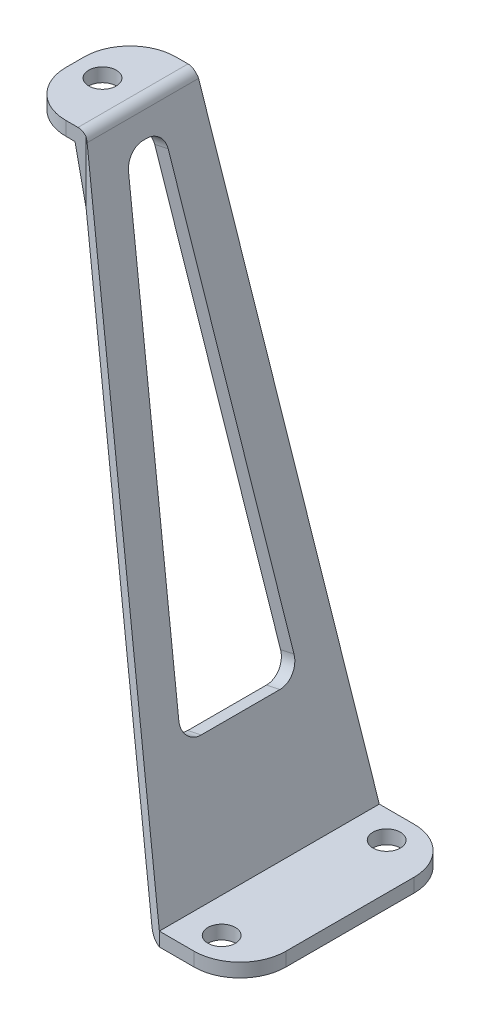
ISO-10303-21;
HEADER;
FILE_DESCRIPTION(('STEP AP214'),'2;1');
FILE_NAME('part.step','',(''),(''),'','','');
FILE_SCHEMA(('AUTOMOTIVE_DESIGN { 1 0 10303 214 1 1 1 1 }'));
ENDSEC;
DATA;
#1=APPLICATION_CONTEXT('core data for automotive mechanical design processes');
#2=APPLICATION_PROTOCOL_DEFINITION('international standard','automotive_design',2000,#1);
#3=PRODUCT_CONTEXT('',#1,'mechanical');
#4=PRODUCT('Part','Part','',(#3));
#5=PRODUCT_RELATED_PRODUCT_CATEGORY('part','',(#4));
#6=PRODUCT_DEFINITION_FORMATION('','',#4);
#7=PRODUCT_DEFINITION_CONTEXT('part definition',#1,'design');
#8=PRODUCT_DEFINITION('design','',#6,#7);
#9=PRODUCT_DEFINITION_SHAPE('','',#8);
#10=(LENGTH_UNIT() NAMED_UNIT(*) SI_UNIT(.MILLI.,.METRE.));
#11=(NAMED_UNIT(*) PLANE_ANGLE_UNIT() SI_UNIT($,.RADIAN.));
#12=(NAMED_UNIT(*) SI_UNIT($,.STERADIAN.) SOLID_ANGLE_UNIT());
#13=UNCERTAINTY_MEASURE_WITH_UNIT(LENGTH_MEASURE(1.E-05),#10,'distance_accuracy_value','');
#14=(GEOMETRIC_REPRESENTATION_CONTEXT(3) GLOBAL_UNCERTAINTY_ASSIGNED_CONTEXT((#13)) GLOBAL_UNIT_ASSIGNED_CONTEXT((#10,
#11,#12)) REPRESENTATION_CONTEXT('',''));
#15=CARTESIAN_POINT('',(0.,0.,0.));
#16=DIRECTION('',(0.,0.,1.));
#17=DIRECTION('',(1.,0.,0.));
#18=AXIS2_PLACEMENT_3D('',#15,#16,#17);
#19=CARTESIAN_POINT('',(-21.2,65.5,12.));
#20=DIRECTION('',(1.,0.,0.));
#21=DIRECTION('',(0.,0.,-1.));
#22=AXIS2_PLACEMENT_3D('',#19,#20,#21);
#23=PLANE('',#22);
#24=DIRECTION('',(0.,0.,-1.));
#25=VECTOR('',#24,1.);
#26=CARTESIAN_POINT('',(-21.2,64.,12.));
#27=LINE('',#26,#25);
#28=CARTESIAN_POINT('',(-21.2,64.,1.));
#29=VERTEX_POINT('',#28);
#30=CARTESIAN_POINT('',(-21.2,64.,-1.));
#31=VERTEX_POINT('',#30);
#32=EDGE_CURVE('E255',#29,#31,#27,.T.);
#33=ORIENTED_EDGE('',*,*,#32,.F.);
#34=DIRECTION('',(0.,1.,0.));
#35=VECTOR('',#34,1.);
#36=CARTESIAN_POINT('',(-21.2,65.5,1.));
#37=LINE('',#36,#35);
#38=CARTESIAN_POINT('',(-21.2,65.5,1.));
#39=VERTEX_POINT('',#38);
#40=EDGE_CURVE('E282',#29,#39,#37,.T.);
#41=ORIENTED_EDGE('',*,*,#40,.T.);
#42=DIRECTION('',(0.,0.,-1.));
#43=VECTOR('',#42,1.);
#44=CARTESIAN_POINT('',(-21.2,65.5,12.));
#45=LINE('',#44,#43);
#46=CARTESIAN_POINT('',(-21.2,65.5,-1.));
#47=VERTEX_POINT('',#46);
#48=EDGE_CURVE('E241',#39,#47,#45,.T.);
#49=ORIENTED_EDGE('',*,*,#48,.T.);
#50=DIRECTION('',(0.,1.,0.));
#51=VECTOR('',#50,1.);
#52=CARTESIAN_POINT('',(-21.2,64.,-1.));
#53=LINE('',#52,#51);
#54=EDGE_CURVE('E280',#47,#31,#53,.F.);
#55=ORIENTED_EDGE('',*,*,#54,.T.);
#56=EDGE_LOOP('',(#33,#41,#49,#55));
#57=FACE_BOUND('',#56,.T.);
#58=ADVANCED_FACE('F33',(#57),#23,.F.);
#59=CARTESIAN_POINT('',(-15.2,64.,12.));
#60=DIRECTION('',(0.,1.,0.));
#61=DIRECTION('',(0.,0.,1.));
#62=AXIS2_PLACEMENT_3D('',#59,#60,#61);
#63=PLANE('',#62);
#64=CARTESIAN_POINT('',(-18.2,64.,0.));
#65=DIRECTION('',(0.,1.,0.));
#66=DIRECTION('',(0.,0.,1.));
#67=AXIS2_PLACEMENT_3D('',#64,#65,#66);
#68=CIRCLE('',#67,1.5);
#69=CARTESIAN_POINT('',(-18.2,64.,1.5));
#70=VERTEX_POINT('',#69);
#71=EDGE_CURVE('E410',#70,#70,#68,.T.);
#72=ORIENTED_EDGE('',*,*,#71,.T.);
#73=EDGE_LOOP('',(#72));
#74=FACE_BOUND('',#73,.T.);
#75=DIRECTION('',(1.,0.,0.));
#76=VECTOR('',#75,1.);
#77=CARTESIAN_POINT('',(-15.2,64.,6.));
#78=LINE('',#77,#76);
#79=CARTESIAN_POINT('',(-16.2,64.,6.));
#80=VERTEX_POINT('',#79);
#81=CARTESIAN_POINT('',(-15.2,64.,6.));
#82=VERTEX_POINT('',#81);
#83=EDGE_CURVE('E405',#80,#82,#78,.T.);
#84=ORIENTED_EDGE('',*,*,#83,.F.);
#85=CARTESIAN_POINT('',(-16.2,64.,1.));
#86=DIRECTION('',(0.,1.,0.));
#87=DIRECTION('',(0.,0.,1.));
#88=AXIS2_PLACEMENT_3D('',#85,#86,#87);
#89=CIRCLE('',#88,5.);
#90=EDGE_CURVE('E294',#80,#29,#89,.F.);
#91=ORIENTED_EDGE('',*,*,#90,.T.);
#92=ORIENTED_EDGE('',*,*,#32,.T.);
#93=CARTESIAN_POINT('',(-16.2,64.,-1.));
#94=DIRECTION('',(0.,1.,0.));
#95=DIRECTION('',(0.,0.,1.));
#96=AXIS2_PLACEMENT_3D('',#93,#94,#95);
#97=CIRCLE('',#96,5.);
#98=CARTESIAN_POINT('',(-16.2,64.,-6.));
#99=VERTEX_POINT('',#98);
#100=EDGE_CURVE('E292',#31,#99,#97,.F.);
#101=ORIENTED_EDGE('',*,*,#100,.T.);
#102=DIRECTION('',(-1.,0.,0.));
#103=VECTOR('',#102,1.);
#104=CARTESIAN_POINT('',(-15.2,64.,-6.));
#105=LINE('',#104,#103);
#106=CARTESIAN_POINT('',(-15.2,64.,-6.));
#107=VERTEX_POINT('',#106);
#108=EDGE_CURVE('E400',#107,#99,#105,.T.);
#109=ORIENTED_EDGE('',*,*,#108,.F.);
#110=DIRECTION('',(0.,0.,-1.));
#111=VECTOR('',#110,1.);
#112=CARTESIAN_POINT('',(-15.2,64.,12.));
#113=LINE('',#112,#111);
#114=EDGE_CURVE('E252',#82,#107,#113,.T.);
#115=ORIENTED_EDGE('',*,*,#114,.F.);
#116=EDGE_LOOP('',(#84,#91,#92,#101,#109,#115));
#117=FACE_BOUND('',#116,.T.);
#118=ADVANCED_FACE('F464',(#74,#117),#63,.F.);
#119=CARTESIAN_POINT('',(-1.21351525368033,-1.5,12.));
#120=DIRECTION('',(0.977952752107879,0.208826278625621,0.));
#121=DIRECTION('',(-0.208826278625621,0.977952752107879,0.));
#122=AXIS2_PLACEMENT_3D('',#119,#120,#121);
#123=PLANE('',#122);
#124=DIRECTION('',(0.207993352675428,-0.974052082945671,0.089226145002657));
#125=VECTOR('',#124,1.);
#126=CARTESIAN_POINT('',(-1.1410017035461,-1.83958765336245,8.12379984031756));
#127=LINE('',#126,#125);
#128=CARTESIAN_POINT('',(-14.387815366747,60.1964643409008,2.44110805458352));
#129=VERTEX_POINT('',#128);
#130=CARTESIAN_POINT('',(-4.78180654996839,15.2106377439384,6.56194713216787));
#131=VERTEX_POINT('',#130);
#132=EDGE_CURVE('E224',#129,#131,#127,.T.);
#133=ORIENTED_EDGE('',*,*,#132,.T.);
#134=CARTESIAN_POINT('',(-4.74454102233436,15.0361198358077,4.56992434610545));
#135=DIRECTION('',(0.977952752107879,0.208826278625621,0.));
#136=DIRECTION('',(-0.208826278625621,0.977952752107879,0.));
#137=AXIS2_PLACEMENT_3D('',#134,#135,#136);
#138=CIRCLE('',#137,2.);
#139=CARTESIAN_POINT('',(-4.32688846508312,13.080214331592,4.56992434610546));
#140=VERTEX_POINT('',#139);
#141=EDGE_CURVE('E12',#131,#140,#138,.T.);
#142=ORIENTED_EDGE('',*,*,#141,.T.);
#143=DIRECTION('',(0.,0.,-1.));
#144=VECTOR('',#143,1.);
#145=CARTESIAN_POINT('',(-4.32688846508312,13.080214331592,12.));
#146=LINE('',#145,#144);
#147=CARTESIAN_POINT('',(-4.32688846508312,13.080214331592,-4.01406932324407));
#148=VERTEX_POINT('',#147);
#149=EDGE_CURVE('E358',#140,#148,#146,.T.);
#150=ORIENTED_EDGE('',*,*,#149,.T.);
#151=CARTESIAN_POINT('',(-4.74454102233436,15.0361198358077,-4.01406932324407));
#152=DIRECTION('',(0.977952752107879,0.208826278625621,0.));
#153=DIRECTION('',(-0.208826278625621,0.977952752107879,0.));
#154=AXIS2_PLACEMENT_3D('',#151,#152,#153);
#155=CIRCLE('',#154,2.);
#156=CARTESIAN_POINT('',(-4.78180654996839,15.2106377439384,-6.00609210930649));
#157=VERTEX_POINT('',#156);
#158=EDGE_CURVE('E348',#148,#157,#155,.T.);
#159=ORIENTED_EDGE('',*,*,#158,.T.);
#160=DIRECTION('',(-0.207993352675428,0.974052082945671,0.0892261450026568));
#161=VECTOR('',#160,1.);
#162=CARTESIAN_POINT('',(-1.57608857974087,0.197964376875611,-7.38129882995345));
#163=LINE('',#162,#161);
#164=CARTESIAN_POINT('',(-14.387815366747,60.1964643409008,-1.88525303172214));
#165=VERTEX_POINT('',#164);
#166=EDGE_CURVE('E375',#157,#165,#163,.T.);
#167=ORIENTED_EDGE('',*,*,#166,.T.);
#168=CARTESIAN_POINT('',(-14.3505498391129,60.0219464327701,0.106769754340266));
#169=DIRECTION('',(0.977952752107879,0.208826278625621,0.));
#170=DIRECTION('',(-0.208826278625621,0.977952752107879,0.));
#171=AXIS2_PLACEMENT_3D('',#168,#169,#170);
#172=CIRCLE('',#171,2.);
#173=CARTESIAN_POINT('',(-14.7682023963642,61.9778519369859,0.106769754340267));
#174=VERTEX_POINT('',#173);
#175=EDGE_CURVE('E328',#165,#174,#172,.T.);
#176=ORIENTED_EDGE('',*,*,#175,.T.);
#177=DIRECTION('',(0.,0.,1.));
#178=VECTOR('',#177,1.);
#179=CARTESIAN_POINT('',(-14.7682023963642,61.9778519369859,12.));
#180=LINE('',#179,#178);
#181=CARTESIAN_POINT('',(-14.7682023963642,61.9778519369859,0.449085268521107));
#182=VERTEX_POINT('',#181);
#183=EDGE_CURVE('E377',#174,#182,#180,.T.);
#184=ORIENTED_EDGE('',*,*,#183,.T.);
#185=CARTESIAN_POINT('',(-14.3505498391129,60.0219464327701,0.449085268521107));
#186=DIRECTION('',(0.977952752107879,0.208826278625621,0.));
#187=DIRECTION('',(-0.208826278625621,0.977952752107879,0.));
#188=AXIS2_PLACEMENT_3D('',#185,#186,#187);
#189=CIRCLE('',#188,2.);
#190=EDGE_CURVE('E337',#182,#129,#189,.T.);
#191=ORIENTED_EDGE('',*,*,#190,.T.);
#192=EDGE_LOOP('',(#133,#142,#150,#159,#167,#176,#184,#191));
#193=FACE_BOUND('',#192,.T.);
#194=DIRECTION('',(-0.207993352675428,0.974052082945671,0.0892261450026568));
#195=VECTOR('',#194,1.);
#196=CARTESIAN_POINT('',(-1.64925676977159,0.540617769342482,-11.2924926600136));
#197=LINE('',#196,#195);
#198=CARTESIAN_POINT('',(-1.39935209496676,-0.629708906488185,-11.3996981570362));
#199=VERTEX_POINT('',#198);
#200=CARTESIAN_POINT('',(-13.9864847463197,58.3169959744906,-6.));
#201=VERTEX_POINT('',#200);
#202=EDGE_CURVE('E390',#199,#201,#197,.T.);
#203=ORIENTED_EDGE('',*,*,#202,.F.);
#204=DIRECTION('',(0.,0.,-1.));
#205=VECTOR('',#204,1.);
#206=CARTESIAN_POINT('',(-1.39935209496676,-0.629708906488185,12.));
#207=LINE('',#206,#205);
#208=CARTESIAN_POINT('',(-1.39935209496676,-0.629708906488184,11.3996981570362));
#209=VERTEX_POINT('',#208);
#210=EDGE_CURVE('E302',#199,#209,#207,.F.);
#211=ORIENTED_EDGE('',*,*,#210,.T.);
#212=DIRECTION('',(0.207993352675428,-0.974052082945671,0.0892261450026568));
#213=VECTOR('',#212,1.);
#214=CARTESIAN_POINT('',(-1.20385408868184,-1.54524412809073,11.4835639788624));
#215=LINE('',#214,#213);
#216=CARTESIAN_POINT('',(-13.9864847463197,58.3169959744905,6.));
#217=VERTEX_POINT('',#216);
#218=EDGE_CURVE('E395',#217,#209,#215,.T.);
#219=ORIENTED_EDGE('',*,*,#218,.F.);
#220=DIRECTION('',(0.208826278625621,-0.977952752107879,0.));
#221=VECTOR('',#220,1.);
#222=CARTESIAN_POINT('',(-1.21351525368033,-1.5,6.));
#223=LINE('',#222,#221);
#224=EDGE_CURVE('E403',#82,#217,#223,.T.);
#225=ORIENTED_EDGE('',*,*,#224,.F.);
#226=ORIENTED_EDGE('',*,*,#114,.T.);
#227=DIRECTION('',(-0.208826278625621,0.977952752107879,0.));
#228=VECTOR('',#227,1.);
#229=CARTESIAN_POINT('',(-1.21351525368033,-1.5,-6.00000000000001));
#230=LINE('',#229,#228);
#231=EDGE_CURVE('E398',#201,#107,#230,.T.);
#232=ORIENTED_EDGE('',*,*,#231,.F.);
#233=EDGE_LOOP('',(#203,#211,#219,#225,#226,#232));
#234=FACE_BOUND('',#233,.T.);
#235=ADVANCED_FACE('F454',(#193,#234),#123,.F.);
#236=CARTESIAN_POINT('',(8.8,-1.5,12.));
#237=DIRECTION('',(0.,1.,0.));
#238=DIRECTION('',(-1.,0.,0.));
#239=AXIS2_PLACEMENT_3D('',#236,#237,#238);
#240=PLANE('',#239);
#241=CARTESIAN_POINT('',(3.8,-1.5,-9.));
#242=DIRECTION('',(0.,1.,0.));
#243=DIRECTION('',(0.,0.,1.));
#244=AXIS2_PLACEMENT_3D('',#241,#242,#243);
#245=CIRCLE('',#244,1.5);
#246=CARTESIAN_POINT('',(3.8,-1.5,-7.5));
#247=VERTEX_POINT('',#246);
#248=EDGE_CURVE('E230',#247,#247,#245,.T.);
#249=ORIENTED_EDGE('',*,*,#248,.T.);
#250=EDGE_LOOP('',(#249));
#251=FACE_BOUND('',#250,.T.);
#252=CARTESIAN_POINT('',(3.8,-1.5,9.));
#253=DIRECTION('',(0.,1.,0.));
#254=DIRECTION('',(0.,0.,1.));
#255=AXIS2_PLACEMENT_3D('',#252,#253,#254);
#256=CIRCLE('',#255,1.5);
#257=CARTESIAN_POINT('',(3.8,-1.5,10.5));
#258=VERTEX_POINT('',#257);
#259=EDGE_CURVE('E416',#258,#258,#256,.T.);
#260=ORIENTED_EDGE('',*,*,#259,.T.);
#261=EDGE_LOOP('',(#260));
#262=FACE_BOUND('',#261,.T.);
#263=DIRECTION('',(0.91900717383439,0.,0.394240807680949));
#264=VECTOR('',#263,1.);
#265=CARTESIAN_POINT('',(-13.9864847463197,-1.5,6.));
#266=LINE('',#265,#264);
#267=CARTESIAN_POINT('',(-0.323604067648094,-1.5,11.8611785276211));
#268=VERTEX_POINT('',#267);
#269=CARTESIAN_POINT('',(0.,-1.5,12.));
#270=VERTEX_POINT('',#269);
#271=EDGE_CURVE('E213',#268,#270,#266,.T.);
#272=ORIENTED_EDGE('',*,*,#271,.F.);
#273=DIRECTION('',(0.,0.,-1.));
#274=VECTOR('',#273,1.);
#275=CARTESIAN_POINT('',(-0.323604067648092,-1.5,12.));
#276=LINE('',#275,#274);
#277=CARTESIAN_POINT('',(-0.323604067648088,-1.5,-11.8611785276211));
#278=VERTEX_POINT('',#277);
#279=EDGE_CURVE('E223',#268,#278,#276,.T.);
#280=ORIENTED_EDGE('',*,*,#279,.T.);
#281=DIRECTION('',(-0.91900717383439,0.,0.394240807680949));
#282=VECTOR('',#281,1.);
#283=CARTESIAN_POINT('',(-13.9864847463197,-1.5,-6.));
#284=LINE('',#283,#282);
#285=CARTESIAN_POINT('',(0.,-1.5,-12.));
#286=VERTEX_POINT('',#285);
#287=EDGE_CURVE('E204',#286,#278,#284,.T.);
#288=ORIENTED_EDGE('',*,*,#287,.F.);
#289=DIRECTION('',(1.,0.,0.));
#290=VECTOR('',#289,1.);
#291=CARTESIAN_POINT('',(8.8,-1.5,-12.));
#292=LINE('',#291,#290);
#293=CARTESIAN_POINT('',(3.8,-1.5,-12.));
#294=VERTEX_POINT('',#293);
#295=EDGE_CURVE('E220',#286,#294,#292,.T.);
#296=ORIENTED_EDGE('',*,*,#295,.T.);
#297=CARTESIAN_POINT('',(3.8,-1.5,-7.));
#298=DIRECTION('',(0.,1.,0.));
#299=DIRECTION('',(-1.,0.,0.));
#300=AXIS2_PLACEMENT_3D('',#297,#298,#299);
#301=CIRCLE('',#300,5.);
#302=CARTESIAN_POINT('',(8.8,-1.5,-7.));
#303=VERTEX_POINT('',#302);
#304=EDGE_CURVE('E278',#294,#303,#301,.F.);
#305=ORIENTED_EDGE('',*,*,#304,.T.);
#306=DIRECTION('',(0.,0.,-1.));
#307=VECTOR('',#306,1.);
#308=CARTESIAN_POINT('',(8.8,-1.5,12.));
#309=LINE('',#308,#307);
#310=CARTESIAN_POINT('',(8.8,-1.5,7.));
#311=VERTEX_POINT('',#310);
#312=EDGE_CURVE('E249',#311,#303,#309,.T.);
#313=ORIENTED_EDGE('',*,*,#312,.F.);
#314=CARTESIAN_POINT('',(3.8,-1.5,7.));
#315=DIRECTION('',(0.,1.,0.));
#316=DIRECTION('',(-1.,0.,0.));
#317=AXIS2_PLACEMENT_3D('',#314,#315,#316);
#318=CIRCLE('',#317,5.);
#319=CARTESIAN_POINT('',(3.8,-1.5,12.));
#320=VERTEX_POINT('',#319);
#321=EDGE_CURVE('E270',#311,#320,#318,.F.);
#322=ORIENTED_EDGE('',*,*,#321,.T.);
#323=DIRECTION('',(1.,0.,0.));
#324=VECTOR('',#323,1.);
#325=CARTESIAN_POINT('',(8.8,-1.5,12.));
#326=LINE('',#325,#324);
#327=EDGE_CURVE('E232',#270,#320,#326,.T.);
#328=ORIENTED_EDGE('',*,*,#327,.F.);
#329=EDGE_LOOP('',(#272,#280,#288,#296,#305,#313,#322,#328));
#330=FACE_BOUND('',#329,.T.);
#331=ADVANCED_FACE('F219',(#251,#262,#330),#240,.F.);
#332=CARTESIAN_POINT('',(-13.9864847463197,65.5,12.));
#333=DIRECTION('',(-0.977952752107879,-0.208826278625621,0.));
#334=DIRECTION('',(0.208826278625621,-0.977952752107879,0.));
#335=AXIS2_PLACEMENT_3D('',#332,#333,#334);
#336=PLANE('',#335);
#337=DIRECTION('',(0.,0.,-1.));
#338=VECTOR('',#337,1.);
#339=CARTESIAN_POINT('',(-2.8599593369213,13.3934537495304,6.75710042184846));
#340=LINE('',#339,#338);
#341=CARTESIAN_POINT('',(-2.8599593369213,13.3934537495304,4.56992434610546));
#342=VERTEX_POINT('',#341);
#343=CARTESIAN_POINT('',(-2.8599593369213,13.3934537495304,-4.01406932324407));
#344=VERTEX_POINT('',#343);
#345=EDGE_CURVE('E357',#342,#344,#340,.T.);
#346=ORIENTED_EDGE('',*,*,#345,.F.);
#347=CARTESIAN_POINT('',(-3.27761189417254,15.3493592537462,4.56992434610545));
#348=DIRECTION('',(-0.977952752107879,-0.208826278625621,0.));
#349=DIRECTION('',(0.208826278625621,-0.977952752107879,0.));
#350=AXIS2_PLACEMENT_3D('',#347,#348,#349);
#351=CIRCLE('',#350,2.);
#352=CARTESIAN_POINT('',(-3.31487742180657,15.5238771618768,6.56194713216787));
#353=VERTEX_POINT('',#352);
#354=EDGE_CURVE('E41',#342,#353,#351,.T.);
#355=ORIENTED_EDGE('',*,*,#354,.T.);
#356=DIRECTION('',(0.207993352675428,-0.974052082945671,0.0892261450026569));
#357=VECTOR('',#356,1.);
#358=CARTESIAN_POINT('',(-2.8599593369213,13.3934537495304,6.75710042184846));
#359=LINE('',#358,#357);
#360=CARTESIAN_POINT('',(-12.9208862385851,60.5097037588392,2.44110805458352));
#361=VERTEX_POINT('',#360);
#362=EDGE_CURVE('E366',#361,#353,#359,.T.);
#363=ORIENTED_EDGE('',*,*,#362,.F.);
#364=CARTESIAN_POINT('',(-12.8836207109511,60.3351858507086,0.449085268521107));
#365=DIRECTION('',(-0.977952752107879,-0.208826278625621,0.));
#366=DIRECTION('',(0.208826278625621,-0.977952752107879,0.));
#367=AXIS2_PLACEMENT_3D('',#364,#365,#366);
#368=CIRCLE('',#367,2.);
#369=CARTESIAN_POINT('',(-13.3012732682024,62.2910913549243,0.449085268521107));
#370=VERTEX_POINT('',#369);
#371=EDGE_CURVE('E335',#361,#370,#368,.T.);
#372=ORIENTED_EDGE('',*,*,#371,.T.);
#373=DIRECTION('',(0.,0.,1.));
#374=VECTOR('',#373,1.);
#375=CARTESIAN_POINT('',(-13.3012732682024,62.2910913549243,2.27792751143069));
#376=LINE('',#375,#374);
#377=CARTESIAN_POINT('',(-13.3012732682024,62.2910913549243,0.106769754340266));
#378=VERTEX_POINT('',#377);
#379=EDGE_CURVE('E368',#378,#370,#376,.T.);
#380=ORIENTED_EDGE('',*,*,#379,.F.);
#381=CARTESIAN_POINT('',(-12.8836207109511,60.3351858507086,0.106769754340266));
#382=DIRECTION('',(-0.977952752107879,-0.208826278625621,0.));
#383=DIRECTION('',(0.208826278625621,-0.977952752107879,0.));
#384=AXIS2_PLACEMENT_3D('',#381,#382,#383);
#385=CIRCLE('',#384,2.);
#386=CARTESIAN_POINT('',(-12.9208862385851,60.5097037588392,-1.88525303172215));
#387=VERTEX_POINT('',#386);
#388=EDGE_CURVE('E325',#378,#387,#385,.T.);
#389=ORIENTED_EDGE('',*,*,#388,.T.);
#390=DIRECTION('',(-0.207993352675428,0.974052082945671,0.0892261450026568));
#391=VECTOR('',#390,1.);
#392=CARTESIAN_POINT('',(-13.3012732682024,62.2910913549243,-1.72207248856931));
#393=LINE('',#392,#391);
#394=CARTESIAN_POINT('',(-3.31487742180657,15.5238771618768,-6.00609210930649));
#395=VERTEX_POINT('',#394);
#396=EDGE_CURVE('E365',#395,#387,#393,.T.);
#397=ORIENTED_EDGE('',*,*,#396,.F.);
#398=CARTESIAN_POINT('',(-3.27761189417254,15.3493592537462,-4.01406932324407));
#399=DIRECTION('',(-0.977952752107879,-0.208826278625621,0.));
#400=DIRECTION('',(0.208826278625621,-0.977952752107879,0.));
#401=AXIS2_PLACEMENT_3D('',#398,#399,#400);
#402=CIRCLE('',#401,2.);
#403=EDGE_CURVE('E345',#395,#344,#402,.T.);
#404=ORIENTED_EDGE('',*,*,#403,.T.);
#405=EDGE_LOOP('',(#346,#355,#363,#372,#380,#389,#397,#404));
#406=FACE_BOUND('',#405,.T.);
#407=DIRECTION('',(0.207993352675428,-0.974052082945671,-0.0892261450026569));
#408=VECTOR('',#407,1.);
#409=CARTESIAN_POINT('',(-14.320536757137,67.0643964230749,-5.85669651086337));
#410=LINE('',#409,#408);
#411=CARTESIAN_POINT('',(-13.8006479050332,64.6297089064882,-6.07972132154307));
#412=VERTEX_POINT('',#411);
#413=CARTESIAN_POINT('',(0.,0.,-12.));
#414=VERTEX_POINT('',#413);
#415=EDGE_CURVE('E206',#412,#414,#410,.T.);
#416=ORIENTED_EDGE('',*,*,#415,.F.);
#417=DIRECTION('',(0.,0.,-1.));
#418=VECTOR('',#417,1.);
#419=CARTESIAN_POINT('',(-13.8006479050332,64.6297089064882,12.));
#420=LINE('',#419,#418);
#421=CARTESIAN_POINT('',(-13.8006479050332,64.6297089064882,6.07972132154307));
#422=VERTEX_POINT('',#421);
#423=EDGE_CURVE('E313',#412,#422,#420,.F.);
#424=ORIENTED_EDGE('',*,*,#423,.T.);
#425=DIRECTION('',(-0.207993352675428,0.974052082945671,-0.0892261450026569));
#426=VECTOR('',#425,1.);
#427=CARTESIAN_POINT('',(-13.8751340760472,64.9785345256417,6.04776782971221));
#428=LINE('',#427,#426);
#429=CARTESIAN_POINT('',(0.,0.,12.));
#430=VERTEX_POINT('',#429);
#431=EDGE_CURVE('E392',#430,#422,#428,.T.);
#432=ORIENTED_EDGE('',*,*,#431,.F.);
#433=DIRECTION('',(0.,0.,-1.));
#434=VECTOR('',#433,1.);
#435=CARTESIAN_POINT('',(0.,0.,12.));
#436=LINE('',#435,#434);
#437=EDGE_CURVE('E244',#430,#414,#436,.T.);
#438=ORIENTED_EDGE('',*,*,#437,.T.);
#439=EDGE_LOOP('',(#416,#424,#432,#438));
#440=FACE_BOUND('',#439,.T.);
#441=ADVANCED_FACE('F361',(#406,#440),#336,.F.);
#442=CARTESIAN_POINT('',(-21.2,65.5,12.));
#443=DIRECTION('',(0.,-1.,0.));
#444=DIRECTION('',(0.,0.,-1.));
#445=AXIS2_PLACEMENT_3D('',#442,#443,#444);
#446=PLANE('',#445);
#447=CARTESIAN_POINT('',(-18.2,65.5,0.));
#448=DIRECTION('',(0.,1.,0.));
#449=DIRECTION('',(0.,0.,1.));
#450=AXIS2_PLACEMENT_3D('',#447,#448,#449);
#451=CIRCLE('',#450,1.5);
#452=CARTESIAN_POINT('',(-18.2,65.5,1.5));
#453=VERTEX_POINT('',#452);
#454=EDGE_CURVE('E407',#453,#453,#451,.T.);
#455=ORIENTED_EDGE('',*,*,#454,.F.);
#456=EDGE_LOOP('',(#455));
#457=FACE_BOUND('',#456,.T.);
#458=DIRECTION('',(-1.,0.,0.));
#459=VECTOR('',#458,1.);
#460=CARTESIAN_POINT('',(-21.2,65.5,6.));
#461=LINE('',#460,#459);
#462=CARTESIAN_POINT('',(-14.8763959323519,65.5,6.));
#463=VERTEX_POINT('',#462);
#464=CARTESIAN_POINT('',(-16.2,65.5,6.));
#465=VERTEX_POINT('',#464);
#466=EDGE_CURVE('E261',#463,#465,#461,.T.);
#467=ORIENTED_EDGE('',*,*,#466,.F.);
#468=DIRECTION('',(0.,0.,-1.));
#469=VECTOR('',#468,1.);
#470=CARTESIAN_POINT('',(-14.8763959323519,65.5,12.));
#471=LINE('',#470,#469);
#472=CARTESIAN_POINT('',(-14.8763959323519,65.5,-6.));
#473=VERTEX_POINT('',#472);
#474=EDGE_CURVE('E306',#463,#473,#471,.T.);
#475=ORIENTED_EDGE('',*,*,#474,.T.);
#476=DIRECTION('',(1.,0.,0.));
#477=VECTOR('',#476,1.);
#478=CARTESIAN_POINT('',(-21.2,65.5,-6.));
#479=LINE('',#478,#477);
#480=CARTESIAN_POINT('',(-16.2,65.5,-6.));
#481=VERTEX_POINT('',#480);
#482=EDGE_CURVE('E258',#481,#473,#479,.T.);
#483=ORIENTED_EDGE('',*,*,#482,.F.);
#484=CARTESIAN_POINT('',(-16.2,65.5,-1.));
#485=DIRECTION('',(0.,-1.,0.));
#486=DIRECTION('',(0.,0.,-1.));
#487=AXIS2_PLACEMENT_3D('',#484,#485,#486);
#488=CIRCLE('',#487,5.);
#489=EDGE_CURVE('E285',#481,#47,#488,.F.);
#490=ORIENTED_EDGE('',*,*,#489,.T.);
#491=ORIENTED_EDGE('',*,*,#48,.F.);
#492=CARTESIAN_POINT('',(-16.2,65.5,1.));
#493=DIRECTION('',(0.,-1.,0.));
#494=DIRECTION('',(0.,0.,-1.));
#495=AXIS2_PLACEMENT_3D('',#492,#493,#494);
#496=CIRCLE('',#495,5.);
#497=EDGE_CURVE('E287',#39,#465,#496,.F.);
#498=ORIENTED_EDGE('',*,*,#497,.T.);
#499=EDGE_LOOP('',(#467,#475,#483,#490,#491,#498));
#500=FACE_BOUND('',#499,.T.);
#501=ADVANCED_FACE('F473',(#457,#500),#446,.F.);
#502=CARTESIAN_POINT('',(0.,0.,12.));
#503=DIRECTION('',(0.,0.,-1.));
#504=DIRECTION('',(-1.,0.,0.));
#505=AXIS2_PLACEMENT_3D('',#502,#503,#504);
#506=PLANE('',#505);
#507=ORIENTED_EDGE('',*,*,#327,.T.);
#508=DIRECTION('',(0.,1.,0.));
#509=VECTOR('',#508,1.);
#510=CARTESIAN_POINT('',(3.8,0.,12.));
#511=LINE('',#510,#509);
#512=CARTESIAN_POINT('',(3.8,0.,12.));
#513=VERTEX_POINT('',#512);
#514=EDGE_CURVE('E263',#320,#513,#511,.T.);
#515=ORIENTED_EDGE('',*,*,#514,.T.);
#516=DIRECTION('',(-1.,0.,0.));
#517=VECTOR('',#516,1.);
#518=CARTESIAN_POINT('',(0.,0.,12.));
#519=LINE('',#518,#517);
#520=EDGE_CURVE('E238',#513,#430,#519,.T.);
#521=ORIENTED_EDGE('',*,*,#520,.T.);
#522=DIRECTION('',(0.,1.,0.));
#523=VECTOR('',#522,1.);
#524=CARTESIAN_POINT('',(0.,-1.5,12.));
#525=LINE('',#524,#523);
#526=EDGE_CURVE('E382',#270,#430,#525,.T.);
#527=ORIENTED_EDGE('',*,*,#526,.F.);
#528=EDGE_LOOP('',(#507,#515,#521,#527));
#529=FACE_BOUND('',#528,.T.);
#530=ADVANCED_FACE('F426',(#529),#506,.F.);
#531=CARTESIAN_POINT('',(0.,0.,-12.));
#532=DIRECTION('',(0.,0.,-1.));
#533=DIRECTION('',(-1.,0.,0.));
#534=AXIS2_PLACEMENT_3D('',#531,#532,#533);
#535=PLANE('',#534);
#536=DIRECTION('',(-1.,0.,0.));
#537=VECTOR('',#536,1.);
#538=CARTESIAN_POINT('',(0.,0.,-12.));
#539=LINE('',#538,#537);
#540=CARTESIAN_POINT('',(3.8,0.,-12.));
#541=VERTEX_POINT('',#540);
#542=EDGE_CURVE('E229',#541,#414,#539,.T.);
#543=ORIENTED_EDGE('',*,*,#542,.F.);
#544=DIRECTION('',(0.,1.,0.));
#545=VECTOR('',#544,1.);
#546=CARTESIAN_POINT('',(3.8,-1.5,-12.));
#547=LINE('',#546,#545);
#548=EDGE_CURVE('E228',#541,#294,#547,.F.);
#549=ORIENTED_EDGE('',*,*,#548,.T.);
#550=ORIENTED_EDGE('',*,*,#295,.F.);
#551=DIRECTION('',(0.,1.,0.));
#552=VECTOR('',#551,1.);
#553=CARTESIAN_POINT('',(0.,-1.5,-12.));
#554=LINE('',#553,#552);
#555=EDGE_CURVE('E200',#286,#414,#554,.T.);
#556=ORIENTED_EDGE('',*,*,#555,.T.);
#557=EDGE_LOOP('',(#543,#549,#550,#556));
#558=FACE_BOUND('',#557,.T.);
#559=ADVANCED_FACE('F226',(#558),#535,.T.);
#560=CARTESIAN_POINT('',(8.8,0.,12.));
#561=DIRECTION('',(-1.,0.,0.));
#562=DIRECTION('',(0.,0.,1.));
#563=AXIS2_PLACEMENT_3D('',#560,#561,#562);
#564=PLANE('',#563);
#565=ORIENTED_EDGE('',*,*,#312,.T.);
#566=DIRECTION('',(0.,1.,0.));
#567=VECTOR('',#566,1.);
#568=CARTESIAN_POINT('',(8.8,0.,-7.));
#569=LINE('',#568,#567);
#570=CARTESIAN_POINT('',(8.8,0.,-7.));
#571=VERTEX_POINT('',#570);
#572=EDGE_CURVE('E272',#303,#571,#569,.T.);
#573=ORIENTED_EDGE('',*,*,#572,.T.);
#574=DIRECTION('',(0.,0.,-1.));
#575=VECTOR('',#574,1.);
#576=CARTESIAN_POINT('',(8.8,0.,12.));
#577=LINE('',#576,#575);
#578=CARTESIAN_POINT('',(8.8,0.,7.));
#579=VERTEX_POINT('',#578);
#580=EDGE_CURVE('E246',#579,#571,#577,.T.);
#581=ORIENTED_EDGE('',*,*,#580,.F.);
#582=DIRECTION('',(0.,1.,0.));
#583=VECTOR('',#582,1.);
#584=CARTESIAN_POINT('',(8.8,0.,7.));
#585=LINE('',#584,#583);
#586=EDGE_CURVE('E268',#579,#311,#585,.F.);
#587=ORIENTED_EDGE('',*,*,#586,.T.);
#588=EDGE_LOOP('',(#565,#573,#581,#587));
#589=FACE_BOUND('',#588,.T.);
#590=ADVANCED_FACE('F441',(#589),#564,.F.);
#591=CARTESIAN_POINT('',(0.,0.,12.));
#592=DIRECTION('',(0.,-1.,0.));
#593=DIRECTION('',(0.,0.,-1.));
#594=AXIS2_PLACEMENT_3D('',#591,#592,#593);
#595=PLANE('',#594);
#596=CARTESIAN_POINT('',(3.8,0.,-9.));
#597=DIRECTION('',(0.,1.,0.));
#598=DIRECTION('',(0.,0.,1.));
#599=AXIS2_PLACEMENT_3D('',#596,#597,#598);
#600=CIRCLE('',#599,1.5);
#601=CARTESIAN_POINT('',(3.8,0.,-7.5));
#602=VERTEX_POINT('',#601);
#603=EDGE_CURVE('E235',#602,#602,#600,.T.);
#604=ORIENTED_EDGE('',*,*,#603,.F.);
#605=EDGE_LOOP('',(#604));
#606=FACE_BOUND('',#605,.T.);
#607=CARTESIAN_POINT('',(3.8,0.,9.));
#608=DIRECTION('',(0.,1.,0.));
#609=DIRECTION('',(0.,0.,1.));
#610=AXIS2_PLACEMENT_3D('',#607,#608,#609);
#611=CIRCLE('',#610,1.5);
#612=CARTESIAN_POINT('',(3.8,0.,10.5));
#613=VERTEX_POINT('',#612);
#614=EDGE_CURVE('E412',#613,#613,#611,.T.);
#615=ORIENTED_EDGE('',*,*,#614,.F.);
#616=EDGE_LOOP('',(#615));
#617=FACE_BOUND('',#616,.T.);
#618=ORIENTED_EDGE('',*,*,#580,.T.);
#619=CARTESIAN_POINT('',(3.8,0.,-7.));
#620=DIRECTION('',(0.,-1.,0.));
#621=DIRECTION('',(0.,0.,-1.));
#622=AXIS2_PLACEMENT_3D('',#619,#620,#621);
#623=CIRCLE('',#622,5.);
#624=EDGE_CURVE('E275',#571,#541,#623,.F.);
#625=ORIENTED_EDGE('',*,*,#624,.T.);
#626=ORIENTED_EDGE('',*,*,#542,.T.);
#627=ORIENTED_EDGE('',*,*,#437,.F.);
#628=ORIENTED_EDGE('',*,*,#520,.F.);
#629=CARTESIAN_POINT('',(3.8,0.,7.));
#630=DIRECTION('',(0.,-1.,0.));
#631=DIRECTION('',(0.,0.,-1.));
#632=AXIS2_PLACEMENT_3D('',#629,#630,#631);
#633=CIRCLE('',#632,5.);
#634=EDGE_CURVE('E266',#513,#579,#633,.F.);
#635=ORIENTED_EDGE('',*,*,#634,.T.);
#636=EDGE_LOOP('',(#618,#625,#626,#627,#628,#635));
#637=FACE_BOUND('',#636,.T.);
#638=ADVANCED_FACE('F434',(#606,#617,#637),#595,.F.);
#639=CARTESIAN_POINT('',(3.8,-1.5,9.));
#640=DIRECTION('',(0.,1.,0.));
#641=DIRECTION('',(0.,0.,1.));
#642=AXIS2_PLACEMENT_3D('',#639,#640,#641);
#643=CYLINDRICAL_SURFACE('',#642,1.5);
#644=ORIENTED_EDGE('',*,*,#259,.F.);
#645=EDGE_LOOP('',(#644));
#646=FACE_BOUND('',#645,.T.);
#647=ORIENTED_EDGE('',*,*,#614,.T.);
#648=EDGE_LOOP('',(#647));
#649=FACE_BOUND('',#648,.T.);
#650=ADVANCED_FACE('F564',(#646,#649),#643,.F.);
#651=CARTESIAN_POINT('',(3.8,-1.5,-9.));
#652=DIRECTION('',(0.,1.,0.));
#653=DIRECTION('',(0.,0.,1.));
#654=AXIS2_PLACEMENT_3D('',#651,#652,#653);
#655=CYLINDRICAL_SURFACE('',#654,1.5);
#656=ORIENTED_EDGE('',*,*,#248,.F.);
#657=EDGE_LOOP('',(#656));
#658=FACE_BOUND('',#657,.T.);
#659=ORIENTED_EDGE('',*,*,#603,.T.);
#660=EDGE_LOOP('',(#659));
#661=FACE_BOUND('',#660,.T.);
#662=ADVANCED_FACE('F560',(#658,#661),#655,.F.);
#663=CARTESIAN_POINT('',(-18.2,-1.5,0.));
#664=DIRECTION('',(0.,1.,0.));
#665=DIRECTION('',(0.,0.,1.));
#666=AXIS2_PLACEMENT_3D('',#663,#664,#665);
#667=CYLINDRICAL_SURFACE('',#666,1.5);
#668=ORIENTED_EDGE('',*,*,#454,.T.);
#669=EDGE_LOOP('',(#668));
#670=FACE_BOUND('',#669,.T.);
#671=ORIENTED_EDGE('',*,*,#71,.F.);
#672=EDGE_LOOP('',(#671));
#673=FACE_BOUND('',#672,.T.);
#674=ADVANCED_FACE('F557',(#670,#673),#667,.F.);
#675=CARTESIAN_POINT('',(-13.9864847463197,-1.5,-6.));
#676=DIRECTION('',(-0.394240807680949,0.,-0.91900717383439));
#677=DIRECTION('',(-0.91900717383439,0.,0.394240807680949));
#678=AXIS2_PLACEMENT_3D('',#675,#676,#677);
#679=PLANE('',#678);
#680=DIRECTION('',(0.,1.,0.));
#681=VECTOR('',#680,1.);
#682=CARTESIAN_POINT('',(-13.9864847463197,-1.5,-6.));
#683=LINE('',#682,#681);
#684=CARTESIAN_POINT('',(-13.9864847463197,65.0465741109685,-6.));
#685=VERTEX_POINT('',#684);
#686=EDGE_CURVE('E212',#201,#685,#683,.T.);
#687=ORIENTED_EDGE('',*,*,#686,.T.);
#688=CARTESIAN_POINT('',(-14.8763959323519,64.4,-5.61824095095815));
#689=DIRECTION('',(-0.394240807680949,0.,-0.91900717383439));
#690=DIRECTION('',(0.91900717383439,0.,-0.394240807680949));
#691=AXIS2_PLACEMENT_3D('',#688,#689,#690);
#692=ELLIPSE('',#691,1.19694386651026,1.1);
#693=EDGE_CURVE('E311',#685,#412,#692,.T.);
#694=ORIENTED_EDGE('',*,*,#693,.T.);
#695=ORIENTED_EDGE('',*,*,#415,.T.);
#696=ORIENTED_EDGE('',*,*,#555,.F.);
#697=ORIENTED_EDGE('',*,*,#287,.T.);
#698=CARTESIAN_POINT('',(-0.323604067648092,-0.400000000000001,-11.8611785276211));
#699=DIRECTION('',(-0.394240807680949,0.,-0.91900717383439));
#700=DIRECTION('',(0.91900717383439,0.,-0.394240807680949));
#701=AXIS2_PLACEMENT_3D('',#698,#699,#700);
#702=ELLIPSE('',#701,1.19694386651026,1.1);
#703=EDGE_CURVE('E300',#278,#199,#702,.T.);
#704=ORIENTED_EDGE('',*,*,#703,.T.);
#705=ORIENTED_EDGE('',*,*,#202,.T.);
#706=EDGE_LOOP('',(#687,#694,#695,#696,#697,#704,#705));
#707=FACE_BOUND('',#706,.T.);
#708=ADVANCED_FACE('F203',(#707),#679,.T.);
#709=CARTESIAN_POINT('',(-21.2,-1.5,-6.));
#710=DIRECTION('',(0.,0.,-1.));
#711=DIRECTION('',(-1.,0.,0.));
#712=AXIS2_PLACEMENT_3D('',#709,#710,#711);
#713=PLANE('',#712);
#714=ORIENTED_EDGE('',*,*,#482,.T.);
#715=CARTESIAN_POINT('',(-14.8763959323519,64.4,-6.));
#716=DIRECTION('',(0.,0.,-1.));
#717=DIRECTION('',(-1.,0.,0.));
#718=AXIS2_PLACEMENT_3D('',#715,#716,#717);
#719=CIRCLE('',#718,1.1);
#720=EDGE_CURVE('E309',#473,#685,#719,.T.);
#721=ORIENTED_EDGE('',*,*,#720,.T.);
#722=ORIENTED_EDGE('',*,*,#686,.F.);
#723=ORIENTED_EDGE('',*,*,#231,.T.);
#724=ORIENTED_EDGE('',*,*,#108,.T.);
#725=DIRECTION('',(0.,1.,0.));
#726=VECTOR('',#725,1.);
#727=CARTESIAN_POINT('',(-16.2,65.5,-6.));
#728=LINE('',#727,#726);
#729=EDGE_CURVE('E296',#99,#481,#728,.T.);
#730=ORIENTED_EDGE('',*,*,#729,.T.);
#731=EDGE_LOOP('',(#714,#721,#722,#723,#724,#730));
#732=FACE_BOUND('',#731,.T.);
#733=ADVANCED_FACE('F460',(#732),#713,.T.);
#734=CARTESIAN_POINT('',(-21.2,-1.5,6.));
#735=DIRECTION('',(0.,0.,1.));
#736=DIRECTION('',(1.,0.,0.));
#737=AXIS2_PLACEMENT_3D('',#734,#735,#736);
#738=PLANE('',#737);
#739=DIRECTION('',(0.,1.,0.));
#740=VECTOR('',#739,1.);
#741=CARTESIAN_POINT('',(-13.9864847463197,-1.5,6.));
#742=LINE('',#741,#740);
#743=CARTESIAN_POINT('',(-13.9864847463197,65.0465741109685,6.));
#744=VERTEX_POINT('',#743);
#745=EDGE_CURVE('E385',#217,#744,#742,.T.);
#746=ORIENTED_EDGE('',*,*,#745,.T.);
#747=CARTESIAN_POINT('',(-14.8763959323519,64.4,6.));
#748=DIRECTION('',(0.,0.,1.));
#749=DIRECTION('',(1.,0.,0.));
#750=AXIS2_PLACEMENT_3D('',#747,#748,#749);
#751=CIRCLE('',#750,1.1);
#752=EDGE_CURVE('E317',#744,#463,#751,.T.);
#753=ORIENTED_EDGE('',*,*,#752,.T.);
#754=ORIENTED_EDGE('',*,*,#466,.T.);
#755=DIRECTION('',(0.,1.,0.));
#756=VECTOR('',#755,1.);
#757=CARTESIAN_POINT('',(-16.2,64.,6.));
#758=LINE('',#757,#756);
#759=EDGE_CURVE('E290',#465,#80,#758,.F.);
#760=ORIENTED_EDGE('',*,*,#759,.T.);
#761=ORIENTED_EDGE('',*,*,#83,.T.);
#762=ORIENTED_EDGE('',*,*,#224,.T.);
#763=EDGE_LOOP('',(#746,#753,#754,#760,#761,#762));
#764=FACE_BOUND('',#763,.T.);
#765=ADVANCED_FACE('F482',(#764),#738,.T.);
#766=CARTESIAN_POINT('',(-13.9864847463197,-1.5,6.));
#767=DIRECTION('',(-0.394240807680949,0.,0.91900717383439));
#768=DIRECTION('',(0.91900717383439,0.,0.394240807680949));
#769=AXIS2_PLACEMENT_3D('',#766,#767,#768);
#770=PLANE('',#769);
#771=ORIENTED_EDGE('',*,*,#431,.T.);
#772=CARTESIAN_POINT('',(-14.8763959323519,64.4,5.61824095095814));
#773=DIRECTION('',(-0.394240807680949,0.,0.91900717383439));
#774=DIRECTION('',(-0.91900717383439,0.,-0.394240807680949));
#775=AXIS2_PLACEMENT_3D('',#772,#773,#774);
#776=ELLIPSE('',#775,1.19694386651026,1.1);
#777=EDGE_CURVE('E315',#422,#744,#776,.T.);
#778=ORIENTED_EDGE('',*,*,#777,.T.);
#779=ORIENTED_EDGE('',*,*,#745,.F.);
#780=ORIENTED_EDGE('',*,*,#218,.T.);
#781=CARTESIAN_POINT('',(-0.323604067648092,-0.400000000000001,11.8611785276211));
#782=DIRECTION('',(-0.394240807680949,0.,0.91900717383439));
#783=DIRECTION('',(-0.91900717383439,0.,-0.394240807680949));
#784=AXIS2_PLACEMENT_3D('',#781,#782,#783);
#785=ELLIPSE('',#784,1.19694386651026,1.1);
#786=EDGE_CURVE('E304',#209,#268,#785,.T.);
#787=ORIENTED_EDGE('',*,*,#786,.T.);
#788=ORIENTED_EDGE('',*,*,#271,.T.);
#789=ORIENTED_EDGE('',*,*,#526,.T.);
#790=EDGE_LOOP('',(#771,#778,#779,#780,#787,#788,#789));
#791=FACE_BOUND('',#790,.T.);
#792=ADVANCED_FACE('F431',(#791),#770,.T.);
#793=CARTESIAN_POINT('',(3.8,0.,7.));
#794=DIRECTION('',(0.,1.,0.));
#795=DIRECTION('',(0.,0.,1.));
#796=AXIS2_PLACEMENT_3D('',#793,#794,#795);
#797=CYLINDRICAL_SURFACE('',#796,5.);
#798=ORIENTED_EDGE('',*,*,#321,.F.);
#799=ORIENTED_EDGE('',*,*,#586,.F.);
#800=ORIENTED_EDGE('',*,*,#634,.F.);
#801=ORIENTED_EDGE('',*,*,#514,.F.);
#802=EDGE_LOOP('',(#798,#799,#800,#801));
#803=FACE_BOUND('',#802,.T.);
#804=ADVANCED_FACE('F445',(#803),#797,.T.);
#805=CARTESIAN_POINT('',(3.8,0.,-7.));
#806=DIRECTION('',(0.,-1.,0.));
#807=DIRECTION('',(0.,0.,-1.));
#808=AXIS2_PLACEMENT_3D('',#805,#806,#807);
#809=CYLINDRICAL_SURFACE('',#808,5.);
#810=ORIENTED_EDGE('',*,*,#304,.F.);
#811=ORIENTED_EDGE('',*,*,#548,.F.);
#812=ORIENTED_EDGE('',*,*,#624,.F.);
#813=ORIENTED_EDGE('',*,*,#572,.F.);
#814=EDGE_LOOP('',(#810,#811,#812,#813));
#815=FACE_BOUND('',#814,.T.);
#816=ADVANCED_FACE('F436',(#815),#809,.T.);
#817=CARTESIAN_POINT('',(-16.2,65.5,1.));
#818=DIRECTION('',(0.,-1.,0.));
#819=DIRECTION('',(0.,0.,-1.));
#820=AXIS2_PLACEMENT_3D('',#817,#818,#819);
#821=CYLINDRICAL_SURFACE('',#820,5.);
#822=ORIENTED_EDGE('',*,*,#90,.F.);
#823=ORIENTED_EDGE('',*,*,#759,.F.);
#824=ORIENTED_EDGE('',*,*,#497,.F.);
#825=ORIENTED_EDGE('',*,*,#40,.F.);
#826=EDGE_LOOP('',(#822,#823,#824,#825));
#827=FACE_BOUND('',#826,.T.);
#828=ADVANCED_FACE('F487',(#827),#821,.T.);
#829=CARTESIAN_POINT('',(-16.2,-1.5,-1.));
#830=DIRECTION('',(0.,-1.,0.));
#831=DIRECTION('',(0.,0.,-1.));
#832=AXIS2_PLACEMENT_3D('',#829,#830,#831);
#833=CYLINDRICAL_SURFACE('',#832,5.);
#834=ORIENTED_EDGE('',*,*,#100,.F.);
#835=ORIENTED_EDGE('',*,*,#54,.F.);
#836=ORIENTED_EDGE('',*,*,#489,.F.);
#837=ORIENTED_EDGE('',*,*,#729,.F.);
#838=EDGE_LOOP('',(#834,#835,#836,#837));
#839=FACE_BOUND('',#838,.T.);
#840=ADVANCED_FACE('F469',(#839),#833,.T.);
#841=CARTESIAN_POINT('',(-0.323604067648092,-0.400000000000001,12.));
#842=DIRECTION('',(0.,0.,-1.));
#843=DIRECTION('',(-1.,0.,0.));
#844=AXIS2_PLACEMENT_3D('',#841,#842,#843);
#845=CYLINDRICAL_SURFACE('',#844,1.1);
#846=ORIENTED_EDGE('',*,*,#786,.F.);
#847=ORIENTED_EDGE('',*,*,#210,.F.);
#848=ORIENTED_EDGE('',*,*,#703,.F.);
#849=ORIENTED_EDGE('',*,*,#279,.F.);
#850=EDGE_LOOP('',(#846,#847,#848,#849));
#851=FACE_BOUND('',#850,.T.);
#852=ADVANCED_FACE('F448',(#851),#845,.T.);
#853=CARTESIAN_POINT('',(-14.8763959323519,64.4,12.));
#854=DIRECTION('',(0.,0.,-1.));
#855=DIRECTION('',(-1.,0.,0.));
#856=AXIS2_PLACEMENT_3D('',#853,#854,#855);
#857=CYLINDRICAL_SURFACE('',#856,1.1);
#858=ORIENTED_EDGE('',*,*,#777,.F.);
#859=ORIENTED_EDGE('',*,*,#423,.F.);
#860=ORIENTED_EDGE('',*,*,#693,.F.);
#861=ORIENTED_EDGE('',*,*,#720,.F.);
#862=ORIENTED_EDGE('',*,*,#474,.F.);
#863=ORIENTED_EDGE('',*,*,#752,.F.);
#864=EDGE_LOOP('',(#858,#859,#860,#861,#862,#863));
#865=FACE_BOUND('',#864,.T.);
#866=ADVANCED_FACE('F478',(#865),#857,.T.);
#867=CARTESIAN_POINT('',(-23.4417942972968,8.99852976900275,6.75710042184846));
#868=DIRECTION('',(-0.0186327638170149,0.087258954065325,0.996011393031207));
#869=DIRECTION('',(0.,-0.996184335625824,0.0872741052875151));
#870=AXIS2_PLACEMENT_3D('',#867,#868,#869);
#871=PLANE('',#870);
#872=ORIENTED_EDGE('',*,*,#362,.T.);
#873=DIRECTION('',(0.977952752107879,0.208826278625621,0.));
#874=VECTOR('',#873,1.);
#875=CARTESIAN_POINT('',(-4.78180654996838,15.2106377439384,6.56194713216787));
#876=LINE('',#875,#874);
#877=EDGE_CURVE('E54',#353,#131,#876,.F.);
#878=ORIENTED_EDGE('',*,*,#877,.T.);
#879=ORIENTED_EDGE('',*,*,#132,.F.);
#880=DIRECTION('',(0.977952752107879,0.208826278625621,0.));
#881=VECTOR('',#880,1.);
#882=CARTESIAN_POINT('',(-12.9208862385851,60.5097037588392,2.44110805458352));
#883=LINE('',#882,#881);
#884=EDGE_CURVE('E330',#129,#361,#883,.T.);
#885=ORIENTED_EDGE('',*,*,#884,.T.);
#886=EDGE_LOOP('',(#872,#878,#879,#885));
#887=FACE_BOUND('',#886,.T.);
#888=ADVANCED_FACE('F510',(#887),#871,.F.);
#889=CARTESIAN_POINT('',(-33.8831082285779,57.8961673743967,2.27792751143069));
#890=DIRECTION('',(-0.208826278625621,0.977952752107879,0.));
#891=DIRECTION('',(-0.977952752107879,-0.208826278625621,0.));
#892=AXIS2_PLACEMENT_3D('',#889,#890,#891);
#893=PLANE('',#892);
#894=ORIENTED_EDGE('',*,*,#379,.T.);
#895=DIRECTION('',(0.977952752107879,0.208826278625621,0.));
#896=VECTOR('',#895,1.);
#897=CARTESIAN_POINT('',(-14.7682023963642,61.9778519369859,0.449085268521107));
#898=LINE('',#897,#896);
#899=EDGE_CURVE('E333',#370,#182,#898,.F.);
#900=ORIENTED_EDGE('',*,*,#899,.T.);
#901=ORIENTED_EDGE('',*,*,#183,.F.);
#902=DIRECTION('',(0.977952752107879,0.208826278625621,0.));
#903=VECTOR('',#902,1.);
#904=CARTESIAN_POINT('',(-13.3012732682023,62.2910913549243,0.106769754340266));
#905=LINE('',#904,#903);
#906=EDGE_CURVE('E319',#174,#378,#905,.T.);
#907=ORIENTED_EDGE('',*,*,#906,.T.);
#908=EDGE_LOOP('',(#894,#900,#901,#907));
#909=FACE_BOUND('',#908,.T.);
#910=ADVANCED_FACE('F536',(#909),#893,.F.);
#911=CARTESIAN_POINT('',(-33.8831082285779,57.8961673743967,-1.72207248856931));
#912=DIRECTION('',(-0.0186327638170149,0.0872589540653249,-0.996011393031207));
#913=DIRECTION('',(0.,0.996184335625824,0.0872741052875149));
#914=AXIS2_PLACEMENT_3D('',#911,#912,#913);
#915=PLANE('',#914);
#916=ORIENTED_EDGE('',*,*,#166,.F.);
#917=DIRECTION('',(0.977952752107879,0.208826278625621,0.));
#918=VECTOR('',#917,1.);
#919=CARTESIAN_POINT('',(-3.31487742180656,15.5238771618768,-6.00609210930649));
#920=LINE('',#919,#918);
#921=EDGE_CURVE('E339',#157,#395,#920,.T.);
#922=ORIENTED_EDGE('',*,*,#921,.T.);
#923=ORIENTED_EDGE('',*,*,#396,.T.);
#924=DIRECTION('',(0.977952752107879,0.208826278625621,0.));
#925=VECTOR('',#924,1.);
#926=CARTESIAN_POINT('',(-14.387815366747,60.1964643409008,-1.88525303172215));
#927=LINE('',#926,#925);
#928=EDGE_CURVE('E322',#387,#165,#927,.F.);
#929=ORIENTED_EDGE('',*,*,#928,.T.);
#930=EDGE_LOOP('',(#916,#922,#923,#929));
#931=FACE_BOUND('',#930,.T.);
#932=ADVANCED_FACE('F529',(#931),#915,.F.);
#933=CARTESIAN_POINT('',(-23.4417942972968,8.99852976900275,6.75710042184846));
#934=DIRECTION('',(0.208826278625621,-0.977952752107879,0.));
#935=DIRECTION('',(0.977952752107879,0.208826278625621,0.));
#936=AXIS2_PLACEMENT_3D('',#933,#934,#935);
#937=PLANE('',#936);
#938=ORIENTED_EDGE('',*,*,#149,.F.);
#939=DIRECTION('',(0.977952752107879,0.208826278625621,0.));
#940=VECTOR('',#939,1.);
#941=CARTESIAN_POINT('',(-2.85995933692129,13.3934537495304,4.56992434610546));
#942=LINE('',#941,#940);
#943=EDGE_CURVE('E350',#140,#342,#942,.T.);
#944=ORIENTED_EDGE('',*,*,#943,.T.);
#945=ORIENTED_EDGE('',*,*,#345,.T.);
#946=DIRECTION('',(0.977952752107879,0.208826278625621,0.));
#947=VECTOR('',#946,1.);
#948=CARTESIAN_POINT('',(-4.32688846508311,13.080214331592,-4.01406932324407));
#949=LINE('',#948,#947);
#950=EDGE_CURVE('E342',#344,#148,#949,.F.);
#951=ORIENTED_EDGE('',*,*,#950,.T.);
#952=EDGE_LOOP('',(#938,#944,#945,#951));
#953=FACE_BOUND('',#952,.T.);
#954=ADVANCED_FACE('F356',(#953),#937,.F.);
#955=CARTESIAN_POINT('',(-33.4654556713266,55.9402618701809,0.106769754340266));
#956=DIRECTION('',(-0.977952752107879,-0.208826278625621,0.));
#957=DIRECTION('',(0.208826278625621,-0.977952752107879,0.));
#958=AXIS2_PLACEMENT_3D('',#955,#956,#957);
#959=CYLINDRICAL_SURFACE('',#958,2.);
#960=ORIENTED_EDGE('',*,*,#175,.F.);
#961=ORIENTED_EDGE('',*,*,#928,.F.);
#962=ORIENTED_EDGE('',*,*,#388,.F.);
#963=ORIENTED_EDGE('',*,*,#906,.F.);
#964=EDGE_LOOP('',(#960,#961,#962,#963));
#965=FACE_BOUND('',#964,.T.);
#966=ADVANCED_FACE('F511',(#965),#959,.F.);
#967=CARTESIAN_POINT('',(-33.4654556713266,55.9402618701809,0.449085268521107));
#968=DIRECTION('',(-0.977952752107879,-0.208826278625621,0.));
#969=DIRECTION('',(0.208826278625621,-0.977952752107879,0.));
#970=AXIS2_PLACEMENT_3D('',#967,#968,#969);
#971=CYLINDRICAL_SURFACE('',#970,2.);
#972=ORIENTED_EDGE('',*,*,#190,.F.);
#973=ORIENTED_EDGE('',*,*,#899,.F.);
#974=ORIENTED_EDGE('',*,*,#371,.F.);
#975=ORIENTED_EDGE('',*,*,#884,.F.);
#976=EDGE_LOOP('',(#972,#973,#974,#975));
#977=FACE_BOUND('',#976,.T.);
#978=ADVANCED_FACE('F514',(#977),#971,.F.);
#979=CARTESIAN_POINT('',(-23.859446854548,10.9544352732185,-4.01406932324407));
#980=DIRECTION('',(-0.977952752107879,-0.208826278625621,0.));
#981=DIRECTION('',(0.208826278625621,-0.977952752107879,0.));
#982=AXIS2_PLACEMENT_3D('',#979,#980,#981);
#983=CYLINDRICAL_SURFACE('',#982,2.);
#984=ORIENTED_EDGE('',*,*,#158,.F.);
#985=ORIENTED_EDGE('',*,*,#950,.F.);
#986=ORIENTED_EDGE('',*,*,#403,.F.);
#987=ORIENTED_EDGE('',*,*,#921,.F.);
#988=EDGE_LOOP('',(#984,#985,#986,#987));
#989=FACE_BOUND('',#988,.T.);
#990=ADVANCED_FACE('F517',(#989),#983,.F.);
#991=CARTESIAN_POINT('',(-23.859446854548,10.9544352732185,4.56992434610545));
#992=DIRECTION('',(-0.977952752107879,-0.208826278625621,0.));
#993=DIRECTION('',(0.208826278625621,-0.977952752107879,0.));
#994=AXIS2_PLACEMENT_3D('',#991,#992,#993);
#995=CYLINDRICAL_SURFACE('',#994,2.);
#996=ORIENTED_EDGE('',*,*,#141,.F.);
#997=ORIENTED_EDGE('',*,*,#877,.F.);
#998=ORIENTED_EDGE('',*,*,#354,.F.);
#999=ORIENTED_EDGE('',*,*,#943,.F.);
#1000=EDGE_LOOP('',(#996,#997,#998,#999));
#1001=FACE_BOUND('',#1000,.T.);
#1002=ADVANCED_FACE('F35',(#1001),#995,.F.);
#1003=CLOSED_SHELL('',(#58,#118,#235,#331,#441,#501,#530,#559,#590,#638,#650,#662,#674,#708,
#733,#765,#792,#804,#816,#828,#840,#852,#866,#888,#910,#932,#954,#966,#978,#990,#1002));
#1004=MANIFOLD_SOLID_BREP('B2',#1003);
#1005=ADVANCED_BREP_SHAPE_REPRESENTATION('',(#18,#1004),#14);
#1006=SHAPE_DEFINITION_REPRESENTATION(#9,#1005);
ENDSEC;
END-ISO-10303-21;
